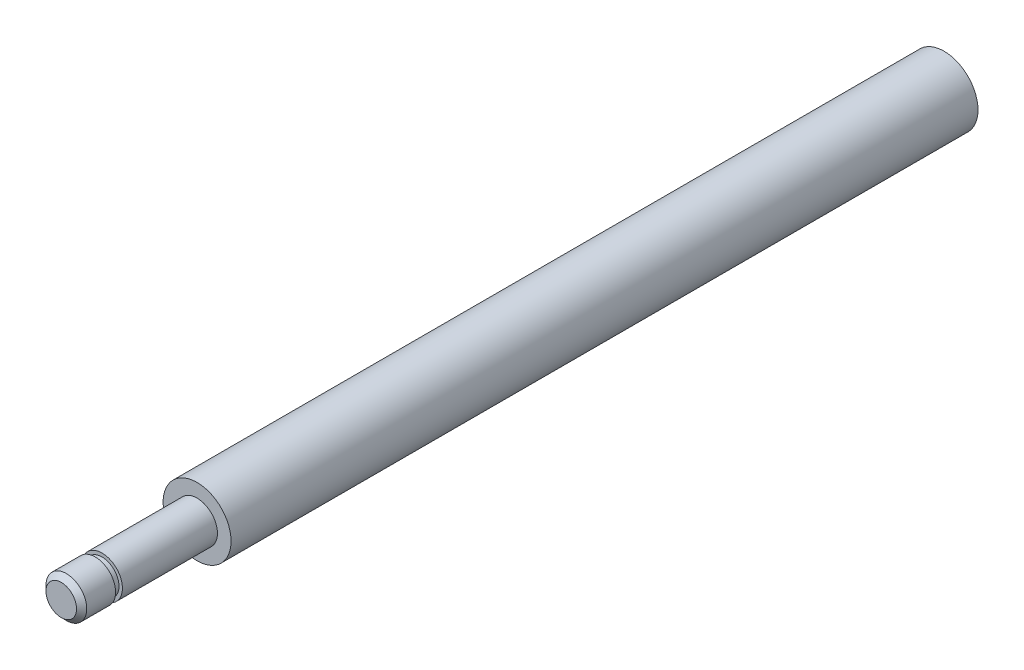
ISO-10303-21;
HEADER;
FILE_DESCRIPTION(('STEP AP214'),'2;1');
FILE_NAME('part.step','',(''),(''),'','','');
FILE_SCHEMA(('AUTOMOTIVE_DESIGN { 1 0 10303 214 1 1 1 1 }'));
ENDSEC;
DATA;
#1=APPLICATION_CONTEXT('core data for automotive mechanical design processes');
#2=APPLICATION_PROTOCOL_DEFINITION('international standard','automotive_design',2000,#1);
#3=PRODUCT_CONTEXT('',#1,'mechanical');
#4=PRODUCT('Part','Part','',(#3));
#5=PRODUCT_RELATED_PRODUCT_CATEGORY('part','',(#4));
#6=PRODUCT_DEFINITION_FORMATION('','',#4);
#7=PRODUCT_DEFINITION_CONTEXT('part definition',#1,'design');
#8=PRODUCT_DEFINITION('design','',#6,#7);
#9=PRODUCT_DEFINITION_SHAPE('','',#8);
#10=(LENGTH_UNIT() NAMED_UNIT(*) SI_UNIT(.MILLI.,.METRE.));
#11=(NAMED_UNIT(*) PLANE_ANGLE_UNIT() SI_UNIT($,.RADIAN.));
#12=(NAMED_UNIT(*) SI_UNIT($,.STERADIAN.) SOLID_ANGLE_UNIT());
#13=UNCERTAINTY_MEASURE_WITH_UNIT(LENGTH_MEASURE(1.E-05),#10,'distance_accuracy_value','');
#14=(GEOMETRIC_REPRESENTATION_CONTEXT(3) GLOBAL_UNCERTAINTY_ASSIGNED_CONTEXT((#13)) GLOBAL_UNIT_ASSIGNED_CONTEXT((#10,
#11,#12)) REPRESENTATION_CONTEXT('',''));
#15=CARTESIAN_POINT('',(0.,0.,0.));
#16=DIRECTION('',(0.,0.,1.));
#17=DIRECTION('',(1.,0.,0.));
#18=AXIS2_PLACEMENT_3D('',#15,#16,#17);
#19=CARTESIAN_POINT('',(0.,0.,220.));
#20=DIRECTION('',(0.,0.,1.));
#21=DIRECTION('',(1.,0.,0.));
#22=AXIS2_PLACEMENT_3D('',#19,#20,#21);
#23=CYLINDRICAL_SURFACE('',#22,6.);
#24=CARTESIAN_POINT('',(0.,0.,220.));
#25=DIRECTION('',(0.,0.,1.));
#26=DIRECTION('',(1.,0.,0.));
#27=AXIS2_PLACEMENT_3D('',#24,#25,#26);
#28=CIRCLE('',#27,6.);
#29=CARTESIAN_POINT('',(6.,0.,220.));
#30=VERTEX_POINT('',#29);
#31=EDGE_CURVE('E57',#30,#30,#28,.T.);
#32=ORIENTED_EDGE('',*,*,#31,.T.);
#33=EDGE_LOOP('',(#32));
#34=FACE_BOUND('',#33,.T.);
#35=CARTESIAN_POINT('',(0.,0.,248.));
#36=DIRECTION('',(0.,0.,1.));
#37=DIRECTION('',(1.,0.,0.));
#38=AXIS2_PLACEMENT_3D('',#35,#36,#37);
#39=CIRCLE('',#38,6.);
#40=CARTESIAN_POINT('',(6.,0.,248.));
#41=VERTEX_POINT('',#40);
#42=EDGE_CURVE('E54',#41,#41,#39,.F.);
#43=ORIENTED_EDGE('',*,*,#42,.T.);
#44=EDGE_LOOP('',(#43));
#45=FACE_BOUND('',#44,.T.);
#46=ADVANCED_FACE('F36',(#34,#45),#23,.T.);
#47=CARTESIAN_POINT('',(0.,0.,260.));
#48=DIRECTION('',(0.,0.,-1.));
#49=DIRECTION('',(-1.,0.,0.));
#50=AXIS2_PLACEMENT_3D('',#47,#48,#49);
#51=CYLINDRICAL_SURFACE('',#50,10.);
#52=CARTESIAN_POINT('',(0.,0.,0.));
#53=DIRECTION('',(0.,0.,1.));
#54=DIRECTION('',(1.,0.,0.));
#55=AXIS2_PLACEMENT_3D('',#52,#53,#54);
#56=CIRCLE('',#55,10.);
#57=CARTESIAN_POINT('',(10.,0.,0.));
#58=VERTEX_POINT('',#57);
#59=EDGE_CURVE('E47',#58,#58,#56,.T.);
#60=ORIENTED_EDGE('',*,*,#59,.T.);
#61=EDGE_LOOP('',(#60));
#62=FACE_BOUND('',#61,.T.);
#63=CARTESIAN_POINT('',(0.,0.,220.));
#64=DIRECTION('',(0.,0.,1.));
#65=DIRECTION('',(1.,0.,0.));
#66=AXIS2_PLACEMENT_3D('',#63,#64,#65);
#67=CIRCLE('',#66,10.);
#68=CARTESIAN_POINT('',(10.,0.,220.));
#69=VERTEX_POINT('',#68);
#70=EDGE_CURVE('E51',#69,#69,#67,.T.);
#71=ORIENTED_EDGE('',*,*,#70,.F.);
#72=EDGE_LOOP('',(#71));
#73=FACE_BOUND('',#72,.T.);
#74=ADVANCED_FACE('F93',(#62,#73),#51,.T.);
#75=CARTESIAN_POINT('',(0.,0.,0.));
#76=DIRECTION('',(0.,0.,1.));
#77=DIRECTION('',(1.,0.,0.));
#78=AXIS2_PLACEMENT_3D('',#75,#76,#77);
#79=PLANE('',#78);
#80=ORIENTED_EDGE('',*,*,#59,.F.);
#81=EDGE_LOOP('',(#80));
#82=FACE_BOUND('',#81,.T.);
#83=ADVANCED_FACE('F87',(#82),#79,.F.);
#84=CARTESIAN_POINT('',(0.,0.,220.));
#85=DIRECTION('',(0.,0.,1.));
#86=DIRECTION('',(1.,0.,0.));
#87=AXIS2_PLACEMENT_3D('',#84,#85,#86);
#88=PLANE('',#87);
#89=ORIENTED_EDGE('',*,*,#31,.F.);
#90=EDGE_LOOP('',(#89));
#91=FACE_BOUND('',#90,.T.);
#92=ORIENTED_EDGE('',*,*,#70,.T.);
#93=EDGE_LOOP('',(#92));
#94=FACE_BOUND('',#93,.T.);
#95=ADVANCED_FACE('F78',(#91,#94),#88,.T.);
#96=CARTESIAN_POINT('',(0.,0.,248.));
#97=DIRECTION('',(0.,0.,1.));
#98=DIRECTION('',(1.,0.,0.));
#99=AXIS2_PLACEMENT_3D('',#96,#97,#98);
#100=PLANE('',#99);
#101=ORIENTED_EDGE('',*,*,#42,.F.);
#102=EDGE_LOOP('',(#101));
#103=FACE_BOUND('',#102,.T.);
#104=CARTESIAN_POINT('',(0.,0.,248.));
#105=DIRECTION('',(0.,0.,1.));
#106=DIRECTION('',(1.,0.,0.));
#107=AXIS2_PLACEMENT_3D('',#104,#105,#106);
#108=CIRCLE('',#107,5.);
#109=CARTESIAN_POINT('',(5.,0.,248.));
#110=VERTEX_POINT('',#109);
#111=EDGE_CURVE('E61',#110,#110,#108,.T.);
#112=ORIENTED_EDGE('',*,*,#111,.F.);
#113=EDGE_LOOP('',(#112));
#114=FACE_BOUND('',#113,.T.);
#115=ADVANCED_FACE('F75',(#103,#114),#100,.T.);
#116=CARTESIAN_POINT('',(0.,0.,250.));
#117=DIRECTION('',(0.,0.,1.));
#118=DIRECTION('',(1.,0.,0.));
#119=AXIS2_PLACEMENT_3D('',#116,#117,#118);
#120=PLANE('',#119);
#121=CARTESIAN_POINT('',(0.,0.,250.));
#122=DIRECTION('',(0.,0.,1.));
#123=DIRECTION('',(1.,0.,0.));
#124=AXIS2_PLACEMENT_3D('',#121,#122,#123);
#125=CIRCLE('',#124,6.);
#126=CARTESIAN_POINT('',(6.,0.,250.));
#127=VERTEX_POINT('',#126);
#128=EDGE_CURVE('E58',#127,#127,#125,.F.);
#129=ORIENTED_EDGE('',*,*,#128,.T.);
#130=EDGE_LOOP('',(#129));
#131=FACE_BOUND('',#130,.T.);
#132=CARTESIAN_POINT('',(0.,0.,250.));
#133=DIRECTION('',(0.,0.,1.));
#134=DIRECTION('',(1.,0.,0.));
#135=AXIS2_PLACEMENT_3D('',#132,#133,#134);
#136=CIRCLE('',#135,5.);
#137=CARTESIAN_POINT('',(5.,0.,250.));
#138=VERTEX_POINT('',#137);
#139=EDGE_CURVE('E66',#138,#138,#136,.T.);
#140=ORIENTED_EDGE('',*,*,#139,.T.);
#141=EDGE_LOOP('',(#140));
#142=FACE_BOUND('',#141,.T.);
#143=ADVANCED_FACE('F77',(#131,#142),#120,.F.);
#144=CARTESIAN_POINT('',(0.,0.,248.));
#145=DIRECTION('',(0.,0.,1.));
#146=DIRECTION('',(1.,0.,0.));
#147=AXIS2_PLACEMENT_3D('',#144,#145,#146);
#148=CYLINDRICAL_SURFACE('',#147,5.);
#149=ORIENTED_EDGE('',*,*,#111,.T.);
#150=EDGE_LOOP('',(#149));
#151=FACE_BOUND('',#150,.T.);
#152=ORIENTED_EDGE('',*,*,#139,.F.);
#153=EDGE_LOOP('',(#152));
#154=FACE_BOUND('',#153,.T.);
#155=ADVANCED_FACE('F72',(#151,#154),#148,.T.);
#156=CARTESIAN_POINT('',(0.,0.,260.));
#157=DIRECTION('',(0.,0.,1.));
#158=DIRECTION('',(1.,0.,0.));
#159=AXIS2_PLACEMENT_3D('',#156,#157,#158);
#160=PLANE('',#159);
#161=CARTESIAN_POINT('',(0.,0.,260.));
#162=DIRECTION('',(0.,0.,1.));
#163=DIRECTION('',(1.,0.,0.));
#164=AXIS2_PLACEMENT_3D('',#161,#162,#163);
#165=CIRCLE('',#164,4.50000000000003);
#166=CARTESIAN_POINT('',(4.50000000000003,0.,260.));
#167=VERTEX_POINT('',#166);
#168=EDGE_CURVE('E43',#167,#167,#165,.T.);
#169=ORIENTED_EDGE('',*,*,#168,.T.);
#170=EDGE_LOOP('',(#169));
#171=FACE_BOUND('',#170,.T.);
#172=ADVANCED_FACE('F103',(#171),#160,.T.);
#173=CARTESIAN_POINT('',(0.,0.,258.5));
#174=DIRECTION('',(0.,0.,1.));
#175=DIRECTION('',(1.,0.,0.));
#176=AXIS2_PLACEMENT_3D('',#173,#174,#175);
#177=CIRCLE('',#176,6.);
#178=CARTESIAN_POINT('',(6.,0.,258.5));
#179=VERTEX_POINT('',#178);
#180=EDGE_CURVE('E11',#179,#179,#177,.F.);
#181=ORIENTED_EDGE('',*,*,#180,.T.);
#182=EDGE_LOOP('',(#181));
#183=FACE_BOUND('',#182,.T.);
#184=ORIENTED_EDGE('',*,*,#128,.F.);
#185=EDGE_LOOP('',(#184));
#186=FACE_BOUND('',#185,.T.);
#187=ADVANCED_FACE('F96',(#183,#186),#23,.T.);
#188=CARTESIAN_POINT('',(0.,0.,260.));
#189=DIRECTION('',(0.,0.,-1.));
#190=DIRECTION('',(-1.,0.,0.));
#191=AXIS2_PLACEMENT_3D('',#188,#189,#190);
#192=CONICAL_SURFACE('',#191,4.50000000000003,0.785398163397456);
#193=ORIENTED_EDGE('',*,*,#180,.F.);
#194=EDGE_LOOP('',(#193));
#195=FACE_BOUND('',#194,.T.);
#196=ORIENTED_EDGE('',*,*,#168,.F.);
#197=EDGE_LOOP('',(#196));
#198=FACE_BOUND('',#197,.T.);
#199=ADVANCED_FACE('F38',(#195,#198),#192,.T.);
#200=CLOSED_SHELL('',(#46,#74,#83,#95,#115,#143,#155,#172,#187,#199));
#201=MANIFOLD_SOLID_BREP('B2',#200);
#202=ADVANCED_BREP_SHAPE_REPRESENTATION('',(#18,#201),#14);
#203=SHAPE_DEFINITION_REPRESENTATION(#9,#202);
ENDSEC;
END-ISO-10303-21;
